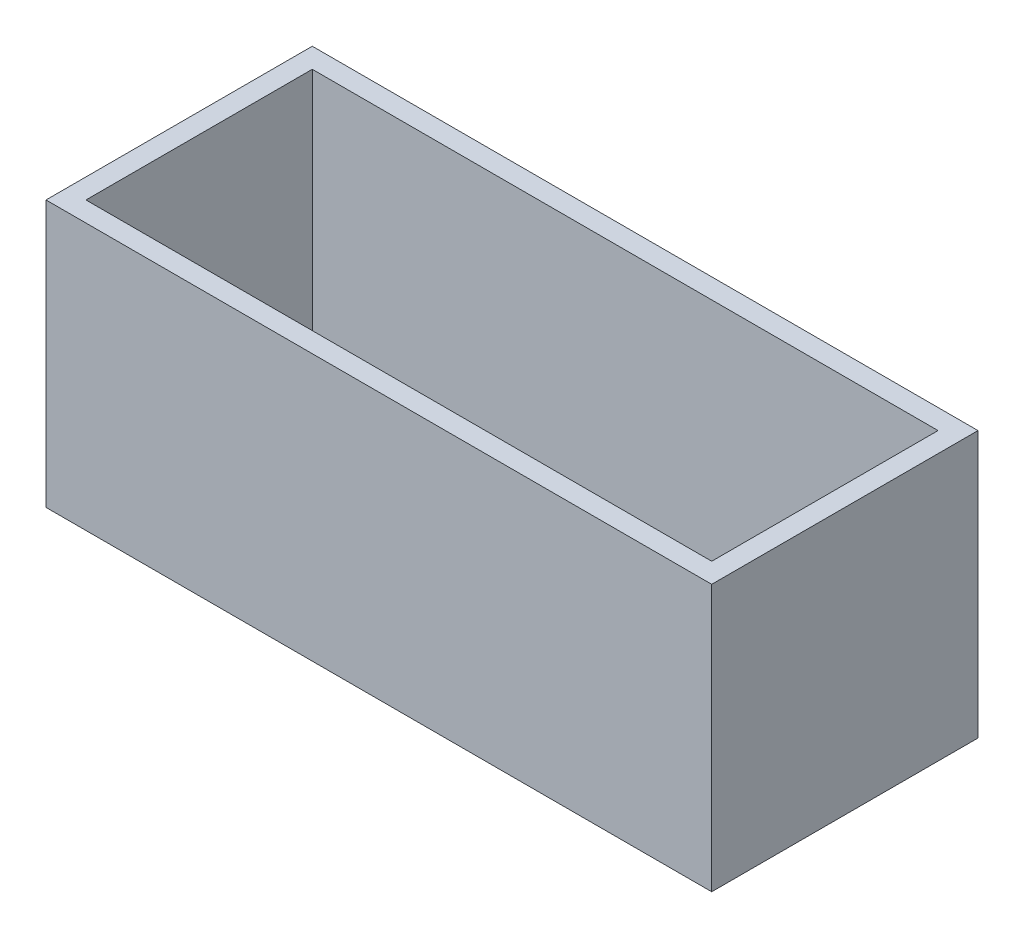
ISO-10303-21;
HEADER;
FILE_DESCRIPTION(('STEP AP214'),'2;1');
FILE_NAME('part.step','',(''),(''),'','','');
FILE_SCHEMA(('AUTOMOTIVE_DESIGN { 1 0 10303 214 1 1 1 1 }'));
ENDSEC;
DATA;
#1=APPLICATION_CONTEXT('core data for automotive mechanical design processes');
#2=APPLICATION_PROTOCOL_DEFINITION('international standard','automotive_design',2000,#1);
#3=PRODUCT_CONTEXT('',#1,'mechanical');
#4=PRODUCT('Part','Part','',(#3));
#5=PRODUCT_RELATED_PRODUCT_CATEGORY('part','',(#4));
#6=PRODUCT_DEFINITION_FORMATION('','',#4);
#7=PRODUCT_DEFINITION_CONTEXT('part definition',#1,'design');
#8=PRODUCT_DEFINITION('design','',#6,#7);
#9=PRODUCT_DEFINITION_SHAPE('','',#8);
#10=(LENGTH_UNIT() NAMED_UNIT(*) SI_UNIT(.MILLI.,.METRE.));
#11=(NAMED_UNIT(*) PLANE_ANGLE_UNIT() SI_UNIT($,.RADIAN.));
#12=(NAMED_UNIT(*) SI_UNIT($,.STERADIAN.) SOLID_ANGLE_UNIT());
#13=UNCERTAINTY_MEASURE_WITH_UNIT(LENGTH_MEASURE(1.E-05),#10,'distance_accuracy_value','');
#14=(GEOMETRIC_REPRESENTATION_CONTEXT(3) GLOBAL_UNCERTAINTY_ASSIGNED_CONTEXT((#13)) GLOBAL_UNIT_ASSIGNED_CONTEXT((#10,
#11,#12)) REPRESENTATION_CONTEXT('',''));
#15=CARTESIAN_POINT('',(0.,0.,0.));
#16=DIRECTION('',(0.,0.,1.));
#17=DIRECTION('',(1.,0.,0.));
#18=AXIS2_PLACEMENT_3D('',#15,#16,#17);
#19=CARTESIAN_POINT('',(50.0000000000001,40.,20.));
#20=DIRECTION('',(-1.,0.,0.));
#21=DIRECTION('',(0.,0.,1.));
#22=AXIS2_PLACEMENT_3D('',#19,#20,#21);
#23=PLANE('',#22);
#24=DIRECTION('',(0.,0.,-1.));
#25=VECTOR('',#24,1.);
#26=CARTESIAN_POINT('',(50.0000000000001,0.,20.));
#27=LINE('',#26,#25);
#28=CARTESIAN_POINT('',(50.0000000000001,0.,20.));
#29=VERTEX_POINT('',#28);
#30=CARTESIAN_POINT('',(50.0000000000001,0.,-20.));
#31=VERTEX_POINT('',#30);
#32=EDGE_CURVE('E141',#29,#31,#27,.T.);
#33=ORIENTED_EDGE('',*,*,#32,.T.);
#34=DIRECTION('',(0.,-1.,0.));
#35=VECTOR('',#34,1.);
#36=CARTESIAN_POINT('',(50.0000000000001,40.,-20.));
#37=LINE('',#36,#35);
#38=CARTESIAN_POINT('',(50.0000000000001,40.,-20.));
#39=VERTEX_POINT('',#38);
#40=EDGE_CURVE('E11',#39,#31,#37,.T.);
#41=ORIENTED_EDGE('',*,*,#40,.F.);
#42=DIRECTION('',(0.,0.,-1.));
#43=VECTOR('',#42,1.);
#44=CARTESIAN_POINT('',(50.0000000000001,40.,20.));
#45=LINE('',#44,#43);
#46=CARTESIAN_POINT('',(50.0000000000001,40.,20.));
#47=VERTEX_POINT('',#46);
#48=EDGE_CURVE('E145',#47,#39,#45,.T.);
#49=ORIENTED_EDGE('',*,*,#48,.F.);
#50=DIRECTION('',(0.,-1.,0.));
#51=VECTOR('',#50,1.);
#52=CARTESIAN_POINT('',(50.0000000000001,40.,20.));
#53=LINE('',#52,#51);
#54=EDGE_CURVE('E151',#47,#29,#53,.T.);
#55=ORIENTED_EDGE('',*,*,#54,.T.);
#56=EDGE_LOOP('',(#33,#41,#49,#55));
#57=FACE_BOUND('',#56,.T.);
#58=ADVANCED_FACE('F33',(#57),#23,.F.);
#59=CARTESIAN_POINT('',(-50.,40.,-20.));
#60=DIRECTION('',(0.,0.,1.));
#61=DIRECTION('',(1.,0.,0.));
#62=AXIS2_PLACEMENT_3D('',#59,#60,#61);
#63=PLANE('',#62);
#64=DIRECTION('',(-1.,0.,0.));
#65=VECTOR('',#64,1.);
#66=CARTESIAN_POINT('',(-50.,0.,-20.));
#67=LINE('',#66,#65);
#68=CARTESIAN_POINT('',(-50.,0.,-20.));
#69=VERTEX_POINT('',#68);
#70=EDGE_CURVE('E154',#31,#69,#67,.T.);
#71=ORIENTED_EDGE('',*,*,#70,.T.);
#72=DIRECTION('',(0.,-1.,0.));
#73=VECTOR('',#72,1.);
#74=CARTESIAN_POINT('',(-50.,40.,-20.));
#75=LINE('',#74,#73);
#76=CARTESIAN_POINT('',(-50.,40.,-20.));
#77=VERTEX_POINT('',#76);
#78=EDGE_CURVE('E40',#77,#69,#75,.T.);
#79=ORIENTED_EDGE('',*,*,#78,.F.);
#80=DIRECTION('',(-1.,0.,0.));
#81=VECTOR('',#80,1.);
#82=CARTESIAN_POINT('',(-50.,40.,-20.));
#83=LINE('',#82,#81);
#84=EDGE_CURVE('E84',#39,#77,#83,.T.);
#85=ORIENTED_EDGE('',*,*,#84,.F.);
#86=ORIENTED_EDGE('',*,*,#40,.T.);
#87=EDGE_LOOP('',(#71,#79,#85,#86));
#88=FACE_BOUND('',#87,.T.);
#89=ADVANCED_FACE('F183',(#88),#63,.F.);
#90=CARTESIAN_POINT('',(-50.,40.,20.));
#91=DIRECTION('',(1.,0.,0.));
#92=DIRECTION('',(0.,0.,-1.));
#93=AXIS2_PLACEMENT_3D('',#90,#91,#92);
#94=PLANE('',#93);
#95=DIRECTION('',(0.,0.,1.));
#96=VECTOR('',#95,1.);
#97=CARTESIAN_POINT('',(-50.,0.,20.));
#98=LINE('',#97,#96);
#99=CARTESIAN_POINT('',(-50.,0.,20.));
#100=VERTEX_POINT('',#99);
#101=EDGE_CURVE('E156',#69,#100,#98,.T.);
#102=ORIENTED_EDGE('',*,*,#101,.T.);
#103=DIRECTION('',(0.,-1.,0.));
#104=VECTOR('',#103,1.);
#105=CARTESIAN_POINT('',(-50.,40.,20.));
#106=LINE('',#105,#104);
#107=CARTESIAN_POINT('',(-50.,40.,20.));
#108=VERTEX_POINT('',#107);
#109=EDGE_CURVE('E160',#108,#100,#106,.T.);
#110=ORIENTED_EDGE('',*,*,#109,.F.);
#111=DIRECTION('',(0.,0.,1.));
#112=VECTOR('',#111,1.);
#113=CARTESIAN_POINT('',(-50.,40.,20.));
#114=LINE('',#113,#112);
#115=EDGE_CURVE('E148',#77,#108,#114,.T.);
#116=ORIENTED_EDGE('',*,*,#115,.F.);
#117=ORIENTED_EDGE('',*,*,#78,.T.);
#118=EDGE_LOOP('',(#102,#110,#116,#117));
#119=FACE_BOUND('',#118,.T.);
#120=ADVANCED_FACE('F165',(#119),#94,.F.);
#121=CARTESIAN_POINT('',(-50.,40.,20.));
#122=DIRECTION('',(0.,0.,-1.));
#123=DIRECTION('',(-1.,0.,0.));
#124=AXIS2_PLACEMENT_3D('',#121,#122,#123);
#125=PLANE('',#124);
#126=DIRECTION('',(1.,0.,0.));
#127=VECTOR('',#126,1.);
#128=CARTESIAN_POINT('',(-50.,0.,20.));
#129=LINE('',#128,#127);
#130=EDGE_CURVE('E77',#100,#29,#129,.T.);
#131=ORIENTED_EDGE('',*,*,#130,.T.);
#132=ORIENTED_EDGE('',*,*,#54,.F.);
#133=DIRECTION('',(1.,0.,0.));
#134=VECTOR('',#133,1.);
#135=CARTESIAN_POINT('',(-50.,40.,20.));
#136=LINE('',#135,#134);
#137=EDGE_CURVE('E56',#108,#47,#136,.T.);
#138=ORIENTED_EDGE('',*,*,#137,.F.);
#139=ORIENTED_EDGE('',*,*,#109,.T.);
#140=EDGE_LOOP('',(#131,#132,#138,#139));
#141=FACE_BOUND('',#140,.T.);
#142=ADVANCED_FACE('F173',(#141),#125,.F.);
#143=CARTESIAN_POINT('',(0.,40.,0.));
#144=DIRECTION('',(0.,-1.,0.));
#145=DIRECTION('',(0.,0.,-1.));
#146=AXIS2_PLACEMENT_3D('',#143,#144,#145);
#147=PLANE('',#146);
#148=DIRECTION('',(-1.,0.,0.));
#149=VECTOR('',#148,1.);
#150=CARTESIAN_POINT('',(-46.9999999999999,40.,-17.));
#151=LINE('',#150,#149);
#152=CARTESIAN_POINT('',(46.9999999999999,40.,-17.));
#153=VERTEX_POINT('',#152);
#154=CARTESIAN_POINT('',(-46.9999999999999,40.,-17.));
#155=VERTEX_POINT('',#154);
#156=EDGE_CURVE('E135',#153,#155,#151,.T.);
#157=ORIENTED_EDGE('',*,*,#156,.F.);
#158=DIRECTION('',(0.,0.,-1.));
#159=VECTOR('',#158,1.);
#160=CARTESIAN_POINT('',(46.9999999999999,40.,17.));
#161=LINE('',#160,#159);
#162=CARTESIAN_POINT('',(46.9999999999999,40.,17.));
#163=VERTEX_POINT('',#162);
#164=EDGE_CURVE('E47',#163,#153,#161,.T.);
#165=ORIENTED_EDGE('',*,*,#164,.F.);
#166=DIRECTION('',(1.,0.,0.));
#167=VECTOR('',#166,1.);
#168=CARTESIAN_POINT('',(-46.9999999999999,40.,17.));
#169=LINE('',#168,#167);
#170=CARTESIAN_POINT('',(-46.9999999999999,40.,17.));
#171=VERTEX_POINT('',#170);
#172=EDGE_CURVE('E126',#171,#163,#169,.T.);
#173=ORIENTED_EDGE('',*,*,#172,.F.);
#174=DIRECTION('',(0.,0.,1.));
#175=VECTOR('',#174,1.);
#176=CARTESIAN_POINT('',(-46.9999999999999,40.,17.));
#177=LINE('',#176,#175);
#178=EDGE_CURVE('E129',#155,#171,#177,.T.);
#179=ORIENTED_EDGE('',*,*,#178,.F.);
#180=EDGE_LOOP('',(#157,#165,#173,#179));
#181=FACE_BOUND('',#180,.T.);
#182=ORIENTED_EDGE('',*,*,#48,.T.);
#183=ORIENTED_EDGE('',*,*,#84,.T.);
#184=ORIENTED_EDGE('',*,*,#115,.T.);
#185=ORIENTED_EDGE('',*,*,#137,.T.);
#186=EDGE_LOOP('',(#182,#183,#184,#185));
#187=FACE_BOUND('',#186,.T.);
#188=ADVANCED_FACE('F175',(#181,#187),#147,.F.);
#189=CARTESIAN_POINT('',(0.,0.,0.));
#190=DIRECTION('',(0.,-1.,0.));
#191=DIRECTION('',(0.,0.,-1.));
#192=AXIS2_PLACEMENT_3D('',#189,#190,#191);
#193=PLANE('',#192);
#194=ORIENTED_EDGE('',*,*,#32,.F.);
#195=ORIENTED_EDGE('',*,*,#130,.F.);
#196=ORIENTED_EDGE('',*,*,#101,.F.);
#197=ORIENTED_EDGE('',*,*,#70,.F.);
#198=EDGE_LOOP('',(#194,#195,#196,#197));
#199=FACE_BOUND('',#198,.T.);
#200=ADVANCED_FACE('F169',(#199),#193,.T.);
#201=CARTESIAN_POINT('',(46.9999999999999,3.,17.));
#202=DIRECTION('',(1.,0.,0.));
#203=DIRECTION('',(0.,0.,-1.));
#204=AXIS2_PLACEMENT_3D('',#201,#202,#203);
#205=PLANE('',#204);
#206=ORIENTED_EDGE('',*,*,#164,.T.);
#207=DIRECTION('',(0.,1.,0.));
#208=VECTOR('',#207,1.);
#209=CARTESIAN_POINT('',(46.9999999999999,3.,-17.));
#210=LINE('',#209,#208);
#211=CARTESIAN_POINT('',(46.9999999999999,3.,-17.));
#212=VERTEX_POINT('',#211);
#213=EDGE_CURVE('E104',#212,#153,#210,.T.);
#214=ORIENTED_EDGE('',*,*,#213,.F.);
#215=DIRECTION('',(0.,0.,-1.));
#216=VECTOR('',#215,1.);
#217=CARTESIAN_POINT('',(46.9999999999999,3.,17.));
#218=LINE('',#217,#216);
#219=CARTESIAN_POINT('',(46.9999999999999,3.,17.));
#220=VERTEX_POINT('',#219);
#221=EDGE_CURVE('E108',#220,#212,#218,.T.);
#222=ORIENTED_EDGE('',*,*,#221,.F.);
#223=DIRECTION('',(0.,1.,0.));
#224=VECTOR('',#223,1.);
#225=CARTESIAN_POINT('',(46.9999999999999,3.,17.));
#226=LINE('',#225,#224);
#227=EDGE_CURVE('E139',#220,#163,#226,.T.);
#228=ORIENTED_EDGE('',*,*,#227,.T.);
#229=EDGE_LOOP('',(#206,#214,#222,#228));
#230=FACE_BOUND('',#229,.T.);
#231=ADVANCED_FACE('F106',(#230),#205,.F.);
#232=CARTESIAN_POINT('',(-46.9999999999999,3.,17.));
#233=DIRECTION('',(0.,0.,1.));
#234=DIRECTION('',(1.,0.,0.));
#235=AXIS2_PLACEMENT_3D('',#232,#233,#234);
#236=PLANE('',#235);
#237=ORIENTED_EDGE('',*,*,#172,.T.);
#238=ORIENTED_EDGE('',*,*,#227,.F.);
#239=DIRECTION('',(1.,0.,0.));
#240=VECTOR('',#239,1.);
#241=CARTESIAN_POINT('',(-46.9999999999999,3.,17.));
#242=LINE('',#241,#240);
#243=CARTESIAN_POINT('',(-46.9999999999999,3.,17.));
#244=VERTEX_POINT('',#243);
#245=EDGE_CURVE('E114',#244,#220,#242,.T.);
#246=ORIENTED_EDGE('',*,*,#245,.F.);
#247=DIRECTION('',(0.,1.,0.));
#248=VECTOR('',#247,1.);
#249=CARTESIAN_POINT('',(-46.9999999999999,3.,17.));
#250=LINE('',#249,#248);
#251=EDGE_CURVE('E142',#244,#171,#250,.T.);
#252=ORIENTED_EDGE('',*,*,#251,.T.);
#253=EDGE_LOOP('',(#237,#238,#246,#252));
#254=FACE_BOUND('',#253,.T.);
#255=ADVANCED_FACE('F222',(#254),#236,.F.);
#256=CARTESIAN_POINT('',(-46.9999999999999,3.,17.));
#257=DIRECTION('',(-1.,0.,0.));
#258=DIRECTION('',(0.,0.,1.));
#259=AXIS2_PLACEMENT_3D('',#256,#257,#258);
#260=PLANE('',#259);
#261=ORIENTED_EDGE('',*,*,#178,.T.);
#262=ORIENTED_EDGE('',*,*,#251,.F.);
#263=DIRECTION('',(0.,0.,1.));
#264=VECTOR('',#263,1.);
#265=CARTESIAN_POINT('',(-46.9999999999999,3.,17.));
#266=LINE('',#265,#264);
#267=CARTESIAN_POINT('',(-46.9999999999999,3.,-17.));
#268=VERTEX_POINT('',#267);
#269=EDGE_CURVE('E122',#268,#244,#266,.T.);
#270=ORIENTED_EDGE('',*,*,#269,.F.);
#271=DIRECTION('',(0.,1.,0.));
#272=VECTOR('',#271,1.);
#273=CARTESIAN_POINT('',(-46.9999999999999,3.,-17.));
#274=LINE('',#273,#272);
#275=EDGE_CURVE('E113',#268,#155,#274,.T.);
#276=ORIENTED_EDGE('',*,*,#275,.T.);
#277=EDGE_LOOP('',(#261,#262,#270,#276));
#278=FACE_BOUND('',#277,.T.);
#279=ADVANCED_FACE('F231',(#278),#260,.F.);
#280=CARTESIAN_POINT('',(-46.9999999999999,3.,-17.));
#281=DIRECTION('',(0.,0.,-1.));
#282=DIRECTION('',(-1.,0.,0.));
#283=AXIS2_PLACEMENT_3D('',#280,#281,#282);
#284=PLANE('',#283);
#285=ORIENTED_EDGE('',*,*,#156,.T.);
#286=ORIENTED_EDGE('',*,*,#275,.F.);
#287=DIRECTION('',(-1.,0.,0.));
#288=VECTOR('',#287,1.);
#289=CARTESIAN_POINT('',(-46.9999999999999,3.,-17.));
#290=LINE('',#289,#288);
#291=EDGE_CURVE('E117',#212,#268,#290,.T.);
#292=ORIENTED_EDGE('',*,*,#291,.F.);
#293=ORIENTED_EDGE('',*,*,#213,.T.);
#294=EDGE_LOOP('',(#285,#286,#292,#293));
#295=FACE_BOUND('',#294,.T.);
#296=ADVANCED_FACE('F118',(#295),#284,.F.);
#297=CARTESIAN_POINT('',(0.,3.,0.));
#298=DIRECTION('',(0.,-1.,0.));
#299=DIRECTION('',(0.,0.,-1.));
#300=AXIS2_PLACEMENT_3D('',#297,#298,#299);
#301=PLANE('',#300);
#302=ORIENTED_EDGE('',*,*,#221,.T.);
#303=ORIENTED_EDGE('',*,*,#291,.T.);
#304=ORIENTED_EDGE('',*,*,#269,.T.);
#305=ORIENTED_EDGE('',*,*,#245,.T.);
#306=EDGE_LOOP('',(#302,#303,#304,#305));
#307=FACE_BOUND('',#306,.T.);
#308=ADVANCED_FACE('F124',(#307),#301,.F.);
#309=CLOSED_SHELL('',(#58,#89,#120,#142,#188,#200,#231,#255,#279,#296,#308));
#310=MANIFOLD_SOLID_BREP('B2',#309);
#311=ADVANCED_BREP_SHAPE_REPRESENTATION('',(#18,#310),#14);
#312=SHAPE_DEFINITION_REPRESENTATION(#9,#311);
ENDSEC;
END-ISO-10303-21;
